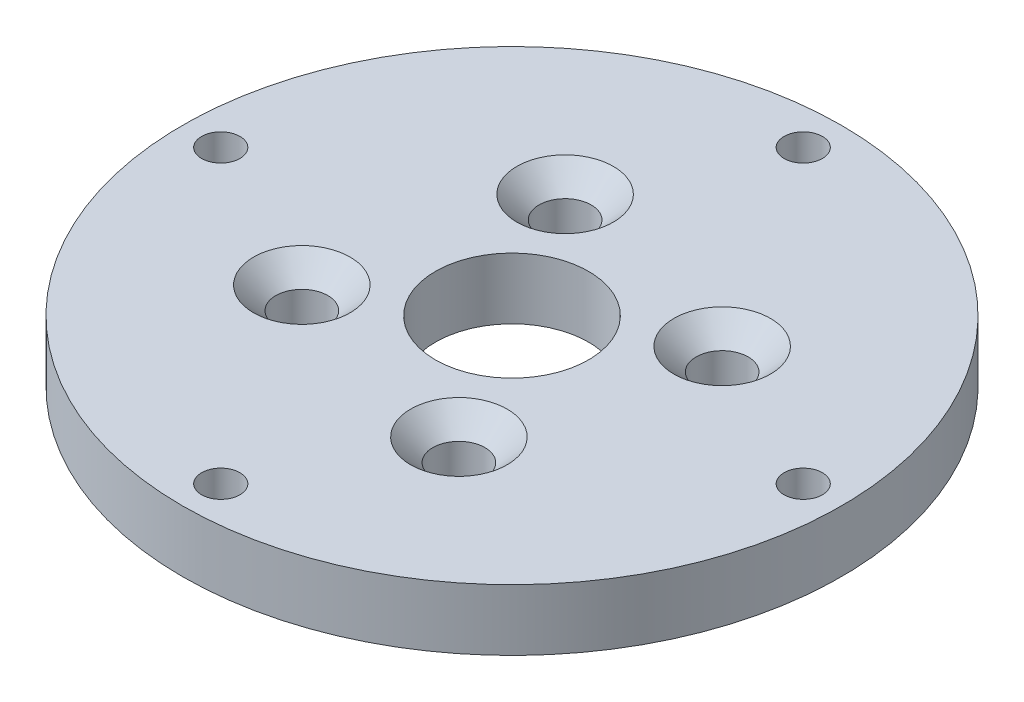
ISO-10303-21;
HEADER;
FILE_DESCRIPTION(('STEP AP214'),'2;1');
FILE_NAME('part.step','',(''),(''),'','','');
FILE_SCHEMA(('AUTOMOTIVE_DESIGN { 1 0 10303 214 1 1 1 1 }'));
ENDSEC;
DATA;
#1=APPLICATION_CONTEXT('core data for automotive mechanical design processes');
#2=APPLICATION_PROTOCOL_DEFINITION('international standard','automotive_design',2000,#1);
#3=PRODUCT_CONTEXT('',#1,'mechanical');
#4=PRODUCT('Part','Part','',(#3));
#5=PRODUCT_RELATED_PRODUCT_CATEGORY('part','',(#4));
#6=PRODUCT_DEFINITION_FORMATION('','',#4);
#7=PRODUCT_DEFINITION_CONTEXT('part definition',#1,'design');
#8=PRODUCT_DEFINITION('design','',#6,#7);
#9=PRODUCT_DEFINITION_SHAPE('','',#8);
#10=(LENGTH_UNIT() NAMED_UNIT(*) SI_UNIT(.MILLI.,.METRE.));
#11=(NAMED_UNIT(*) PLANE_ANGLE_UNIT() SI_UNIT($,.RADIAN.));
#12=(NAMED_UNIT(*) SI_UNIT($,.STERADIAN.) SOLID_ANGLE_UNIT());
#13=UNCERTAINTY_MEASURE_WITH_UNIT(LENGTH_MEASURE(1.E-05),#10,'distance_accuracy_value','');
#14=(GEOMETRIC_REPRESENTATION_CONTEXT(3) GLOBAL_UNCERTAINTY_ASSIGNED_CONTEXT((#13)) GLOBAL_UNIT_ASSIGNED_CONTEXT((#10,
#11,#12)) REPRESENTATION_CONTEXT('',''));
#15=CARTESIAN_POINT('',(0.,0.,0.));
#16=DIRECTION('',(0.,0.,1.));
#17=DIRECTION('',(1.,0.,0.));
#18=AXIS2_PLACEMENT_3D('',#15,#16,#17);
#19=CARTESIAN_POINT('',(0.,4.,0.));
#20=DIRECTION('',(0.,1.,0.));
#21=DIRECTION('',(0.,0.,1.));
#22=AXIS2_PLACEMENT_3D('',#19,#20,#21);
#23=PLANE('',#22);
#24=CARTESIAN_POINT('',(-5.1233442976407,4.,-8.58786022288629));
#25=DIRECTION('',(0.,1.,0.));
#26=DIRECTION('',(0.,0.,1.));
#27=AXIS2_PLACEMENT_3D('',#24,#25,#26);
#28=CIRCLE('',#27,3.15);
#29=CARTESIAN_POINT('',(-5.1233442976407,4.,-5.43786022288629));
#30=VERTEX_POINT('',#29);
#31=EDGE_CURVE('E106',#30,#30,#28,.T.);
#32=ORIENTED_EDGE('',*,*,#31,.F.);
#33=EDGE_LOOP('',(#32));
#34=FACE_BOUND('',#33,.T.);
#35=CARTESIAN_POINT('',(8.58786022288629,4.,-5.1233442976407));
#36=DIRECTION('',(0.,1.,0.));
#37=DIRECTION('',(0.,0.,1.));
#38=AXIS2_PLACEMENT_3D('',#35,#36,#37);
#39=CIRCLE('',#38,3.15);
#40=CARTESIAN_POINT('',(8.58786022288629,4.,-1.9733442976407));
#41=VERTEX_POINT('',#40);
#42=EDGE_CURVE('E97',#41,#41,#39,.T.);
#43=ORIENTED_EDGE('',*,*,#42,.F.);
#44=EDGE_LOOP('',(#43));
#45=FACE_BOUND('',#44,.T.);
#46=CARTESIAN_POINT('',(5.1233442976407,4.,8.58786022288629));
#47=DIRECTION('',(0.,1.,0.));
#48=DIRECTION('',(0.,0.,1.));
#49=AXIS2_PLACEMENT_3D('',#46,#47,#48);
#50=CIRCLE('',#49,3.15);
#51=CARTESIAN_POINT('',(5.1233442976407,4.,11.7378602228863));
#52=VERTEX_POINT('',#51);
#53=EDGE_CURVE('E88',#52,#52,#50,.T.);
#54=ORIENTED_EDGE('',*,*,#53,.F.);
#55=EDGE_LOOP('',(#54));
#56=FACE_BOUND('',#55,.T.);
#57=CARTESIAN_POINT('',(-8.58786022288629,4.,5.1233442976407));
#58=DIRECTION('',(0.,1.,0.));
#59=DIRECTION('',(0.,0.,1.));
#60=AXIS2_PLACEMENT_3D('',#57,#58,#59);
#61=CIRCLE('',#60,3.15);
#62=CARTESIAN_POINT('',(-8.58786022288629,4.,8.2733442976407));
#63=VERTEX_POINT('',#62);
#64=EDGE_CURVE('E79',#63,#63,#61,.T.);
#65=ORIENTED_EDGE('',*,*,#64,.F.);
#66=EDGE_LOOP('',(#65));
#67=FACE_BOUND('',#66,.T.);
#68=CARTESIAN_POINT('',(2.06067016174993E-12,4.,19.));
#69=DIRECTION('',(0.,1.,0.));
#70=DIRECTION('',(0.,0.,1.));
#71=AXIS2_PLACEMENT_3D('',#68,#69,#70);
#72=CIRCLE('',#71,1.25);
#73=CARTESIAN_POINT('',(2.06067016174993E-12,4.,20.25));
#74=VERTEX_POINT('',#73);
#75=EDGE_CURVE('E59',#74,#74,#72,.T.);
#76=ORIENTED_EDGE('',*,*,#75,.F.);
#77=EDGE_LOOP('',(#76));
#78=FACE_BOUND('',#77,.T.);
#79=CARTESIAN_POINT('',(0.,4.,-19.));
#80=DIRECTION('',(0.,1.,0.));
#81=DIRECTION('',(0.,0.,1.));
#82=AXIS2_PLACEMENT_3D('',#79,#80,#81);
#83=CIRCLE('',#82,1.25);
#84=CARTESIAN_POINT('',(0.,4.,-17.75));
#85=VERTEX_POINT('',#84);
#86=EDGE_CURVE('E47',#85,#85,#83,.T.);
#87=ORIENTED_EDGE('',*,*,#86,.F.);
#88=EDGE_LOOP('',(#87));
#89=FACE_BOUND('',#88,.T.);
#90=CARTESIAN_POINT('',(0.,4.,0.));
#91=DIRECTION('',(0.,1.,0.));
#92=DIRECTION('',(0.,0.,1.));
#93=AXIS2_PLACEMENT_3D('',#90,#91,#92);
#94=CIRCLE('',#93,21.5);
#95=CARTESIAN_POINT('',(0.,4.,21.5));
#96=VERTEX_POINT('',#95);
#97=EDGE_CURVE('E10',#96,#96,#94,.T.);
#98=ORIENTED_EDGE('',*,*,#97,.T.);
#99=EDGE_LOOP('',(#98));
#100=FACE_BOUND('',#99,.T.);
#101=CARTESIAN_POINT('',(0.,4.,0.));
#102=DIRECTION('',(0.,1.,0.));
#103=DIRECTION('',(0.,0.,1.));
#104=AXIS2_PLACEMENT_3D('',#101,#102,#103);
#105=CIRCLE('',#104,5.);
#106=CARTESIAN_POINT('',(0.,4.,5.));
#107=VERTEX_POINT('',#106);
#108=EDGE_CURVE('E42',#107,#107,#105,.T.);
#109=ORIENTED_EDGE('',*,*,#108,.F.);
#110=EDGE_LOOP('',(#109));
#111=FACE_BOUND('',#110,.T.);
#112=CARTESIAN_POINT('',(19.000000000001,4.,-1.03033508087497E-12));
#113=DIRECTION('',(0.,1.,0.));
#114=DIRECTION('',(0.,0.,1.));
#115=AXIS2_PLACEMENT_3D('',#112,#113,#114);
#116=CIRCLE('',#115,1.25);
#117=CARTESIAN_POINT('',(19.000000000001,4.,1.24999999999897));
#118=VERTEX_POINT('',#117);
#119=EDGE_CURVE('E53',#118,#118,#116,.T.);
#120=ORIENTED_EDGE('',*,*,#119,.F.);
#121=EDGE_LOOP('',(#120));
#122=FACE_BOUND('',#121,.T.);
#123=CARTESIAN_POINT('',(-18.999999999999,4.,1.03266190979335E-12));
#124=DIRECTION('',(0.,1.,0.));
#125=DIRECTION('',(0.,0.,1.));
#126=AXIS2_PLACEMENT_3D('',#123,#124,#125);
#127=CIRCLE('',#126,1.25);
#128=CARTESIAN_POINT('',(-18.999999999999,4.,1.25000000000103));
#129=VERTEX_POINT('',#128);
#130=EDGE_CURVE('E65',#129,#129,#127,.T.);
#131=ORIENTED_EDGE('',*,*,#130,.F.);
#132=EDGE_LOOP('',(#131));
#133=FACE_BOUND('',#132,.T.);
#134=ADVANCED_FACE('F31',(#34,#45,#56,#67,#78,#89,#100,#111,#122,#133),#23,.T.);
#135=CARTESIAN_POINT('',(0.,0.,0.));
#136=DIRECTION('',(0.,1.,0.));
#137=DIRECTION('',(0.,0.,1.));
#138=AXIS2_PLACEMENT_3D('',#135,#136,#137);
#139=PLANE('',#138);
#140=CARTESIAN_POINT('',(-5.1233442976407,0.,-8.58786022288629));
#141=DIRECTION('',(0.,1.,0.));
#142=DIRECTION('',(0.,0.,1.));
#143=AXIS2_PLACEMENT_3D('',#140,#141,#142);
#144=CIRCLE('',#143,1.7);
#145=CARTESIAN_POINT('',(-5.1233442976407,0.,-6.88786022288629));
#146=VERTEX_POINT('',#145);
#147=EDGE_CURVE('E100',#146,#146,#144,.T.);
#148=ORIENTED_EDGE('',*,*,#147,.T.);
#149=EDGE_LOOP('',(#148));
#150=FACE_BOUND('',#149,.T.);
#151=CARTESIAN_POINT('',(8.58786022288629,0.,-5.1233442976407));
#152=DIRECTION('',(0.,1.,0.));
#153=DIRECTION('',(0.,0.,1.));
#154=AXIS2_PLACEMENT_3D('',#151,#152,#153);
#155=CIRCLE('',#154,1.7);
#156=CARTESIAN_POINT('',(8.58786022288629,0.,-3.4233442976407));
#157=VERTEX_POINT('',#156);
#158=EDGE_CURVE('E91',#157,#157,#155,.T.);
#159=ORIENTED_EDGE('',*,*,#158,.T.);
#160=EDGE_LOOP('',(#159));
#161=FACE_BOUND('',#160,.T.);
#162=CARTESIAN_POINT('',(5.1233442976407,0.,8.58786022288629));
#163=DIRECTION('',(0.,1.,0.));
#164=DIRECTION('',(0.,0.,1.));
#165=AXIS2_PLACEMENT_3D('',#162,#163,#164);
#166=CIRCLE('',#165,1.7);
#167=CARTESIAN_POINT('',(5.1233442976407,0.,10.2878602228863));
#168=VERTEX_POINT('',#167);
#169=EDGE_CURVE('E82',#168,#168,#166,.T.);
#170=ORIENTED_EDGE('',*,*,#169,.T.);
#171=EDGE_LOOP('',(#170));
#172=FACE_BOUND('',#171,.T.);
#173=CARTESIAN_POINT('',(-8.58786022288629,0.,5.1233442976407));
#174=DIRECTION('',(0.,1.,0.));
#175=DIRECTION('',(0.,0.,1.));
#176=AXIS2_PLACEMENT_3D('',#173,#174,#175);
#177=CIRCLE('',#176,1.7);
#178=CARTESIAN_POINT('',(-8.58786022288629,0.,6.8233442976407));
#179=VERTEX_POINT('',#178);
#180=EDGE_CURVE('E71',#179,#179,#177,.T.);
#181=ORIENTED_EDGE('',*,*,#180,.T.);
#182=EDGE_LOOP('',(#181));
#183=FACE_BOUND('',#182,.T.);
#184=CARTESIAN_POINT('',(0.,0.,0.));
#185=DIRECTION('',(0.,1.,0.));
#186=DIRECTION('',(0.,0.,1.));
#187=AXIS2_PLACEMENT_3D('',#184,#185,#186);
#188=CIRCLE('',#187,21.5);
#189=CARTESIAN_POINT('',(0.,0.,21.5));
#190=VERTEX_POINT('',#189);
#191=EDGE_CURVE('E35',#190,#190,#188,.T.);
#192=ORIENTED_EDGE('',*,*,#191,.F.);
#193=EDGE_LOOP('',(#192));
#194=FACE_BOUND('',#193,.T.);
#195=CARTESIAN_POINT('',(0.,0.,0.));
#196=DIRECTION('',(0.,1.,0.));
#197=DIRECTION('',(0.,0.,1.));
#198=AXIS2_PLACEMENT_3D('',#195,#196,#197);
#199=CIRCLE('',#198,5.);
#200=CARTESIAN_POINT('',(0.,0.,5.));
#201=VERTEX_POINT('',#200);
#202=EDGE_CURVE('E44',#201,#201,#199,.T.);
#203=ORIENTED_EDGE('',*,*,#202,.T.);
#204=EDGE_LOOP('',(#203));
#205=FACE_BOUND('',#204,.T.);
#206=CARTESIAN_POINT('',(0.,0.,-19.));
#207=DIRECTION('',(0.,1.,0.));
#208=DIRECTION('',(0.,0.,1.));
#209=AXIS2_PLACEMENT_3D('',#206,#207,#208);
#210=CIRCLE('',#209,1.25);
#211=CARTESIAN_POINT('',(0.,0.,-17.75));
#212=VERTEX_POINT('',#211);
#213=EDGE_CURVE('E50',#212,#212,#210,.T.);
#214=ORIENTED_EDGE('',*,*,#213,.T.);
#215=EDGE_LOOP('',(#214));
#216=FACE_BOUND('',#215,.T.);
#217=CARTESIAN_POINT('',(19.000000000001,0.,-1.03033508087497E-12));
#218=DIRECTION('',(0.,1.,0.));
#219=DIRECTION('',(0.,0.,1.));
#220=AXIS2_PLACEMENT_3D('',#217,#218,#219);
#221=CIRCLE('',#220,1.25);
#222=CARTESIAN_POINT('',(19.000000000001,0.,1.24999999999897));
#223=VERTEX_POINT('',#222);
#224=EDGE_CURVE('E56',#223,#223,#221,.T.);
#225=ORIENTED_EDGE('',*,*,#224,.T.);
#226=EDGE_LOOP('',(#225));
#227=FACE_BOUND('',#226,.T.);
#228=CARTESIAN_POINT('',(2.06067016174993E-12,0.,19.));
#229=DIRECTION('',(0.,1.,0.));
#230=DIRECTION('',(0.,0.,1.));
#231=AXIS2_PLACEMENT_3D('',#228,#229,#230);
#232=CIRCLE('',#231,1.25);
#233=CARTESIAN_POINT('',(2.06067016174993E-12,0.,20.25));
#234=VERTEX_POINT('',#233);
#235=EDGE_CURVE('E62',#234,#234,#232,.T.);
#236=ORIENTED_EDGE('',*,*,#235,.T.);
#237=EDGE_LOOP('',(#236));
#238=FACE_BOUND('',#237,.T.);
#239=CARTESIAN_POINT('',(-18.999999999999,0.,1.03266190979335E-12));
#240=DIRECTION('',(0.,1.,0.));
#241=DIRECTION('',(0.,0.,1.));
#242=AXIS2_PLACEMENT_3D('',#239,#240,#241);
#243=CIRCLE('',#242,1.25);
#244=CARTESIAN_POINT('',(-18.999999999999,0.,1.25000000000103));
#245=VERTEX_POINT('',#244);
#246=EDGE_CURVE('E68',#245,#245,#243,.T.);
#247=ORIENTED_EDGE('',*,*,#246,.T.);
#248=EDGE_LOOP('',(#247));
#249=FACE_BOUND('',#248,.T.);
#250=ADVANCED_FACE('F114',(#150,#161,#172,#183,#194,#205,#216,#227,#238,#249),#139,.F.);
#251=CARTESIAN_POINT('',(0.,4.,0.));
#252=DIRECTION('',(0.,-1.,0.));
#253=DIRECTION('',(0.,0.,-1.));
#254=AXIS2_PLACEMENT_3D('',#251,#252,#253);
#255=CYLINDRICAL_SURFACE('',#254,21.5);
#256=ORIENTED_EDGE('',*,*,#97,.F.);
#257=EDGE_LOOP('',(#256));
#258=FACE_BOUND('',#257,.T.);
#259=ORIENTED_EDGE('',*,*,#191,.T.);
#260=EDGE_LOOP('',(#259));
#261=FACE_BOUND('',#260,.T.);
#262=ADVANCED_FACE('F33',(#258,#261),#255,.T.);
#263=CARTESIAN_POINT('',(0.,4.,0.));
#264=DIRECTION('',(0.,-1.,0.));
#265=DIRECTION('',(0.,0.,-1.));
#266=AXIS2_PLACEMENT_3D('',#263,#264,#265);
#267=CYLINDRICAL_SURFACE('',#266,5.);
#268=ORIENTED_EDGE('',*,*,#108,.T.);
#269=EDGE_LOOP('',(#268));
#270=FACE_BOUND('',#269,.T.);
#271=ORIENTED_EDGE('',*,*,#202,.F.);
#272=EDGE_LOOP('',(#271));
#273=FACE_BOUND('',#272,.T.);
#274=ADVANCED_FACE('F145',(#270,#273),#267,.F.);
#275=CARTESIAN_POINT('',(0.,4.,-19.));
#276=DIRECTION('',(0.,-1.,0.));
#277=DIRECTION('',(0.,0.,-1.));
#278=AXIS2_PLACEMENT_3D('',#275,#276,#277);
#279=CYLINDRICAL_SURFACE('',#278,1.25);
#280=ORIENTED_EDGE('',*,*,#86,.T.);
#281=EDGE_LOOP('',(#280));
#282=FACE_BOUND('',#281,.T.);
#283=ORIENTED_EDGE('',*,*,#213,.F.);
#284=EDGE_LOOP('',(#283));
#285=FACE_BOUND('',#284,.T.);
#286=ADVANCED_FACE('F151',(#282,#285),#279,.F.);
#287=CARTESIAN_POINT('',(19.000000000001,4.,-1.03033508087497E-12));
#288=DIRECTION('',(0.,-1.,0.));
#289=DIRECTION('',(0.,0.,-1.));
#290=AXIS2_PLACEMENT_3D('',#287,#288,#289);
#291=CYLINDRICAL_SURFACE('',#290,1.25);
#292=ORIENTED_EDGE('',*,*,#119,.T.);
#293=EDGE_LOOP('',(#292));
#294=FACE_BOUND('',#293,.T.);
#295=ORIENTED_EDGE('',*,*,#224,.F.);
#296=EDGE_LOOP('',(#295));
#297=FACE_BOUND('',#296,.T.);
#298=ADVANCED_FACE('F155',(#294,#297),#291,.F.);
#299=CARTESIAN_POINT('',(2.06067016174993E-12,4.,19.));
#300=DIRECTION('',(0.,-1.,0.));
#301=DIRECTION('',(0.,0.,-1.));
#302=AXIS2_PLACEMENT_3D('',#299,#300,#301);
#303=CYLINDRICAL_SURFACE('',#302,1.25);
#304=ORIENTED_EDGE('',*,*,#75,.T.);
#305=EDGE_LOOP('',(#304));
#306=FACE_BOUND('',#305,.T.);
#307=ORIENTED_EDGE('',*,*,#235,.F.);
#308=EDGE_LOOP('',(#307));
#309=FACE_BOUND('',#308,.T.);
#310=ADVANCED_FACE('F136',(#306,#309),#303,.F.);
#311=CARTESIAN_POINT('',(-18.999999999999,4.,1.03266190979335E-12));
#312=DIRECTION('',(0.,-1.,0.));
#313=DIRECTION('',(0.,0.,-1.));
#314=AXIS2_PLACEMENT_3D('',#311,#312,#313);
#315=CYLINDRICAL_SURFACE('',#314,1.25);
#316=ORIENTED_EDGE('',*,*,#130,.T.);
#317=EDGE_LOOP('',(#316));
#318=FACE_BOUND('',#317,.T.);
#319=ORIENTED_EDGE('',*,*,#246,.F.);
#320=EDGE_LOOP('',(#319));
#321=FACE_BOUND('',#320,.T.);
#322=ADVANCED_FACE('F132',(#318,#321),#315,.F.);
#323=CARTESIAN_POINT('',(-8.58786022288629,4.,5.1233442976407));
#324=DIRECTION('',(0.,1.,0.));
#325=DIRECTION('',(0.,0.,1.));
#326=AXIS2_PLACEMENT_3D('',#323,#324,#325);
#327=CYLINDRICAL_SURFACE('',#326,1.7);
#328=ORIENTED_EDGE('',*,*,#180,.F.);
#329=EDGE_LOOP('',(#328));
#330=FACE_BOUND('',#329,.T.);
#331=CARTESIAN_POINT('',(-8.58786022288629,2.55,5.1233442976407));
#332=DIRECTION('',(0.,1.,0.));
#333=DIRECTION('',(0.,0.,1.));
#334=AXIS2_PLACEMENT_3D('',#331,#332,#333);
#335=CIRCLE('',#334,1.7);
#336=CARTESIAN_POINT('',(-8.58786022288629,2.55,6.8233442976407));
#337=VERTEX_POINT('',#336);
#338=EDGE_CURVE('E76',#337,#337,#335,.T.);
#339=ORIENTED_EDGE('',*,*,#338,.T.);
#340=EDGE_LOOP('',(#339));
#341=FACE_BOUND('',#340,.T.);
#342=ADVANCED_FACE('F135',(#330,#341),#327,.F.);
#343=CARTESIAN_POINT('',(-8.58786022288629,4.,5.1233442976407));
#344=DIRECTION('',(0.,1.,0.));
#345=DIRECTION('',(0.,0.,1.));
#346=AXIS2_PLACEMENT_3D('',#343,#344,#345);
#347=CONICAL_SURFACE('',#346,3.15,0.785398163397448);
#348=ORIENTED_EDGE('',*,*,#338,.F.);
#349=EDGE_LOOP('',(#348));
#350=FACE_BOUND('',#349,.T.);
#351=ORIENTED_EDGE('',*,*,#64,.T.);
#352=EDGE_LOOP('',(#351));
#353=FACE_BOUND('',#352,.T.);
#354=ADVANCED_FACE('F165',(#350,#353),#347,.F.);
#355=CARTESIAN_POINT('',(5.1233442976407,4.,8.58786022288629));
#356=DIRECTION('',(0.,1.,0.));
#357=DIRECTION('',(0.,0.,1.));
#358=AXIS2_PLACEMENT_3D('',#355,#356,#357);
#359=CYLINDRICAL_SURFACE('',#358,1.7);
#360=ORIENTED_EDGE('',*,*,#169,.F.);
#361=EDGE_LOOP('',(#360));
#362=FACE_BOUND('',#361,.T.);
#363=CARTESIAN_POINT('',(5.1233442976407,2.55,8.58786022288629));
#364=DIRECTION('',(0.,1.,0.));
#365=DIRECTION('',(0.,0.,1.));
#366=AXIS2_PLACEMENT_3D('',#363,#364,#365);
#367=CIRCLE('',#366,1.7);
#368=CARTESIAN_POINT('',(5.1233442976407,2.55,10.2878602228863));
#369=VERTEX_POINT('',#368);
#370=EDGE_CURVE('E85',#369,#369,#367,.T.);
#371=ORIENTED_EDGE('',*,*,#370,.T.);
#372=EDGE_LOOP('',(#371));
#373=FACE_BOUND('',#372,.T.);
#374=ADVANCED_FACE('F169',(#362,#373),#359,.F.);
#375=CARTESIAN_POINT('',(5.1233442976407,4.,8.58786022288629));
#376=DIRECTION('',(0.,1.,0.));
#377=DIRECTION('',(0.,0.,1.));
#378=AXIS2_PLACEMENT_3D('',#375,#376,#377);
#379=CONICAL_SURFACE('',#378,3.15,0.785398163397448);
#380=ORIENTED_EDGE('',*,*,#370,.F.);
#381=EDGE_LOOP('',(#380));
#382=FACE_BOUND('',#381,.T.);
#383=ORIENTED_EDGE('',*,*,#53,.T.);
#384=EDGE_LOOP('',(#383));
#385=FACE_BOUND('',#384,.T.);
#386=ADVANCED_FACE('F173',(#382,#385),#379,.F.);
#387=CARTESIAN_POINT('',(8.58786022288629,4.,-5.1233442976407));
#388=DIRECTION('',(0.,1.,0.));
#389=DIRECTION('',(0.,0.,1.));
#390=AXIS2_PLACEMENT_3D('',#387,#388,#389);
#391=CYLINDRICAL_SURFACE('',#390,1.7);
#392=ORIENTED_EDGE('',*,*,#158,.F.);
#393=EDGE_LOOP('',(#392));
#394=FACE_BOUND('',#393,.T.);
#395=CARTESIAN_POINT('',(8.58786022288629,2.55,-5.1233442976407));
#396=DIRECTION('',(0.,1.,0.));
#397=DIRECTION('',(0.,0.,1.));
#398=AXIS2_PLACEMENT_3D('',#395,#396,#397);
#399=CIRCLE('',#398,1.7);
#400=CARTESIAN_POINT('',(8.58786022288629,2.55,-3.4233442976407));
#401=VERTEX_POINT('',#400);
#402=EDGE_CURVE('E94',#401,#401,#399,.T.);
#403=ORIENTED_EDGE('',*,*,#402,.T.);
#404=EDGE_LOOP('',(#403));
#405=FACE_BOUND('',#404,.T.);
#406=ADVANCED_FACE('F177',(#394,#405),#391,.F.);
#407=CARTESIAN_POINT('',(8.58786022288629,4.,-5.1233442976407));
#408=DIRECTION('',(0.,1.,0.));
#409=DIRECTION('',(0.,0.,1.));
#410=AXIS2_PLACEMENT_3D('',#407,#408,#409);
#411=CONICAL_SURFACE('',#410,3.15,0.785398163397448);
#412=ORIENTED_EDGE('',*,*,#402,.F.);
#413=EDGE_LOOP('',(#412));
#414=FACE_BOUND('',#413,.T.);
#415=ORIENTED_EDGE('',*,*,#42,.T.);
#416=EDGE_LOOP('',(#415));
#417=FACE_BOUND('',#416,.T.);
#418=ADVANCED_FACE('F181',(#414,#417),#411,.F.);
#419=CARTESIAN_POINT('',(-5.1233442976407,4.,-8.58786022288629));
#420=DIRECTION('',(0.,1.,0.));
#421=DIRECTION('',(0.,0.,1.));
#422=AXIS2_PLACEMENT_3D('',#419,#420,#421);
#423=CYLINDRICAL_SURFACE('',#422,1.7);
#424=ORIENTED_EDGE('',*,*,#147,.F.);
#425=EDGE_LOOP('',(#424));
#426=FACE_BOUND('',#425,.T.);
#427=CARTESIAN_POINT('',(-5.1233442976407,2.55,-8.58786022288629));
#428=DIRECTION('',(0.,1.,0.));
#429=DIRECTION('',(0.,0.,1.));
#430=AXIS2_PLACEMENT_3D('',#427,#428,#429);
#431=CIRCLE('',#430,1.7);
#432=CARTESIAN_POINT('',(-5.1233442976407,2.55,-6.88786022288629));
#433=VERTEX_POINT('',#432);
#434=EDGE_CURVE('E103',#433,#433,#431,.T.);
#435=ORIENTED_EDGE('',*,*,#434,.T.);
#436=EDGE_LOOP('',(#435));
#437=FACE_BOUND('',#436,.T.);
#438=ADVANCED_FACE('F185',(#426,#437),#423,.F.);
#439=CARTESIAN_POINT('',(-5.1233442976407,4.,-8.58786022288629));
#440=DIRECTION('',(0.,1.,0.));
#441=DIRECTION('',(0.,0.,1.));
#442=AXIS2_PLACEMENT_3D('',#439,#440,#441);
#443=CONICAL_SURFACE('',#442,3.15,0.785398163397448);
#444=ORIENTED_EDGE('',*,*,#434,.F.);
#445=EDGE_LOOP('',(#444));
#446=FACE_BOUND('',#445,.T.);
#447=ORIENTED_EDGE('',*,*,#31,.T.);
#448=EDGE_LOOP('',(#447));
#449=FACE_BOUND('',#448,.T.);
#450=ADVANCED_FACE('F110',(#446,#449),#443,.F.);
#451=CLOSED_SHELL('',(#134,#250,#262,#274,#286,#298,#310,#322,#342,#354,#374,#386,#406,#418,
#438,#450));
#452=MANIFOLD_SOLID_BREP('B2',#451);
#453=ADVANCED_BREP_SHAPE_REPRESENTATION('',(#18,#452),#14);
#454=SHAPE_DEFINITION_REPRESENTATION(#9,#453);
ENDSEC;
END-ISO-10303-21;
